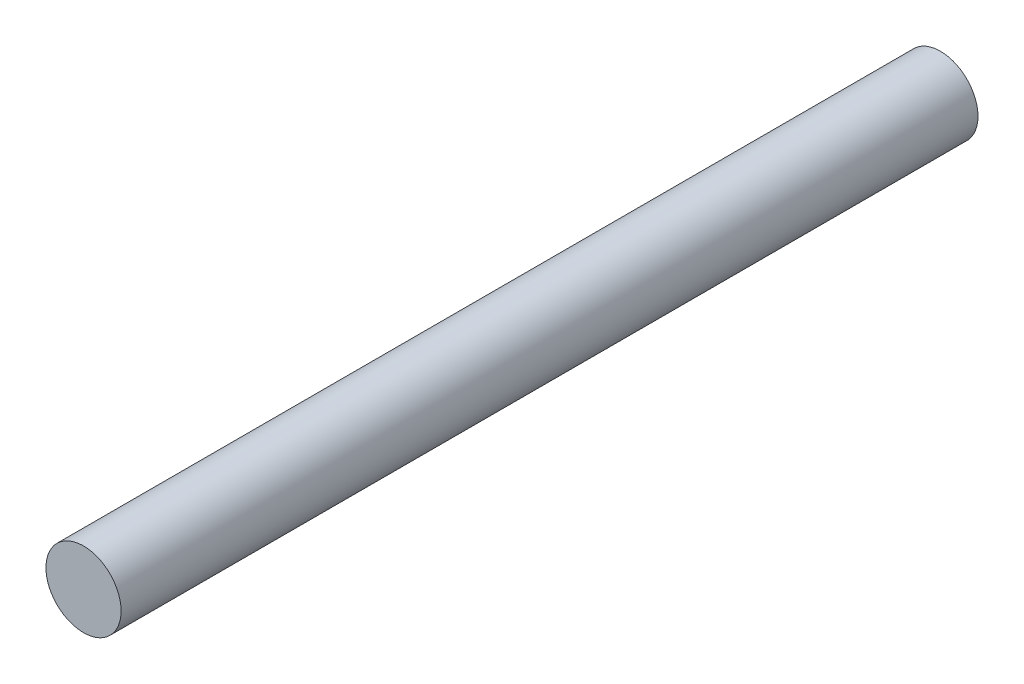
ISO-10303-21;
HEADER;
FILE_DESCRIPTION(('STEP AP214'),'2;1');
FILE_NAME('part.step','',(''),(''),'','','');
FILE_SCHEMA(('AUTOMOTIVE_DESIGN { 1 0 10303 214 1 1 1 1 }'));
ENDSEC;
DATA;
#1=APPLICATION_CONTEXT('core data for automotive mechanical design processes');
#2=APPLICATION_PROTOCOL_DEFINITION('international standard','automotive_design',2000,#1);
#3=PRODUCT_CONTEXT('',#1,'mechanical');
#4=PRODUCT('Part','Part','',(#3));
#5=PRODUCT_RELATED_PRODUCT_CATEGORY('part','',(#4));
#6=PRODUCT_DEFINITION_FORMATION('','',#4);
#7=PRODUCT_DEFINITION_CONTEXT('part definition',#1,'design');
#8=PRODUCT_DEFINITION('design','',#6,#7);
#9=PRODUCT_DEFINITION_SHAPE('','',#8);
#10=(LENGTH_UNIT() NAMED_UNIT(*) SI_UNIT(.MILLI.,.METRE.));
#11=(NAMED_UNIT(*) PLANE_ANGLE_UNIT() SI_UNIT($,.RADIAN.));
#12=(NAMED_UNIT(*) SI_UNIT($,.STERADIAN.) SOLID_ANGLE_UNIT());
#13=UNCERTAINTY_MEASURE_WITH_UNIT(LENGTH_MEASURE(1.E-05),#10,'distance_accuracy_value','');
#14=(GEOMETRIC_REPRESENTATION_CONTEXT(3) GLOBAL_UNCERTAINTY_ASSIGNED_CONTEXT((#13)) GLOBAL_UNIT_ASSIGNED_CONTEXT((#10,
#11,#12)) REPRESENTATION_CONTEXT('',''));
#15=CARTESIAN_POINT('',(0.,0.,0.));
#16=DIRECTION('',(0.,0.,1.));
#17=DIRECTION('',(1.,0.,0.));
#18=AXIS2_PLACEMENT_3D('',#15,#16,#17);
#19=CARTESIAN_POINT('',(0.,0.,22.1488));
#20=DIRECTION('',(0.,0.,-1.));
#21=DIRECTION('',(-1.,0.,0.));
#22=AXIS2_PLACEMENT_3D('',#19,#20,#21);
#23=CYLINDRICAL_SURFACE('',#22,0.97155);
#24=CARTESIAN_POINT('',(0.,0.,22.1488));
#25=DIRECTION('',(0.,0.,1.));
#26=DIRECTION('',(1.,0.,0.));
#27=AXIS2_PLACEMENT_3D('',#24,#25,#26);
#28=CIRCLE('',#27,0.97155);
#29=CARTESIAN_POINT('',(0.97155,0.,22.1488));
#30=VERTEX_POINT('',#29);
#31=EDGE_CURVE('E10',#30,#30,#28,.T.);
#32=ORIENTED_EDGE('',*,*,#31,.F.);
#33=EDGE_LOOP('',(#32));
#34=FACE_BOUND('',#33,.T.);
#35=CARTESIAN_POINT('',(0.,0.,0.));
#36=DIRECTION('',(0.,0.,1.));
#37=DIRECTION('',(1.,0.,0.));
#38=AXIS2_PLACEMENT_3D('',#35,#36,#37);
#39=CIRCLE('',#38,0.97155);
#40=CARTESIAN_POINT('',(0.97155,0.,0.));
#41=VERTEX_POINT('',#40);
#42=EDGE_CURVE('E37',#41,#41,#39,.T.);
#43=ORIENTED_EDGE('',*,*,#42,.T.);
#44=EDGE_LOOP('',(#43));
#45=FACE_BOUND('',#44,.T.);
#46=ADVANCED_FACE('F34',(#34,#45),#23,.T.);
#47=CARTESIAN_POINT('',(0.,0.,22.1488));
#48=DIRECTION('',(0.,0.,1.));
#49=DIRECTION('',(1.,0.,0.));
#50=AXIS2_PLACEMENT_3D('',#47,#48,#49);
#51=PLANE('',#50);
#52=ORIENTED_EDGE('',*,*,#31,.T.);
#53=EDGE_LOOP('',(#52));
#54=FACE_BOUND('',#53,.T.);
#55=ADVANCED_FACE('F49',(#54),#51,.T.);
#56=CARTESIAN_POINT('',(0.,0.,0.));
#57=DIRECTION('',(0.,0.,1.));
#58=DIRECTION('',(1.,0.,0.));
#59=AXIS2_PLACEMENT_3D('',#56,#57,#58);
#60=PLANE('',#59);
#61=ORIENTED_EDGE('',*,*,#42,.F.);
#62=EDGE_LOOP('',(#61));
#63=FACE_BOUND('',#62,.T.);
#64=ADVANCED_FACE('F47',(#63),#60,.F.);
#65=CLOSED_SHELL('',(#46,#55,#64));
#66=MANIFOLD_SOLID_BREP('B2',#65);
#67=ADVANCED_BREP_SHAPE_REPRESENTATION('',(#18,#66),#14);
#68=SHAPE_DEFINITION_REPRESENTATION(#9,#67);
ENDSEC;
END-ISO-10303-21;
